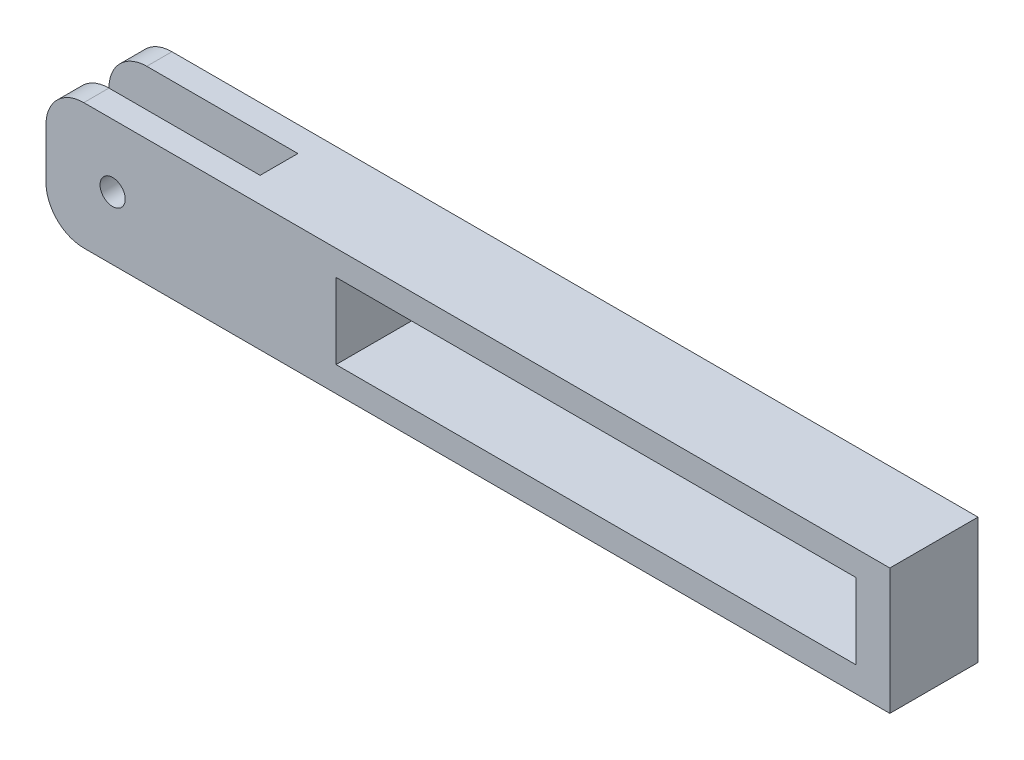
ISO-10303-21;
HEADER;
FILE_DESCRIPTION(('STEP AP214'),'2;1');
FILE_NAME('part.step','',(''),(''),'','','');
FILE_SCHEMA(('AUTOMOTIVE_DESIGN { 1 0 10303 214 1 1 1 1 }'));
ENDSEC;
DATA;
#1=APPLICATION_CONTEXT('core data for automotive mechanical design processes');
#2=APPLICATION_PROTOCOL_DEFINITION('international standard','automotive_design',2000,#1);
#3=PRODUCT_CONTEXT('',#1,'mechanical');
#4=PRODUCT('Part','Part','',(#3));
#5=PRODUCT_RELATED_PRODUCT_CATEGORY('part','',(#4));
#6=PRODUCT_DEFINITION_FORMATION('','',#4);
#7=PRODUCT_DEFINITION_CONTEXT('part definition',#1,'design');
#8=PRODUCT_DEFINITION('design','',#6,#7);
#9=PRODUCT_DEFINITION_SHAPE('','',#8);
#10=(LENGTH_UNIT() NAMED_UNIT(*) SI_UNIT(.MILLI.,.METRE.));
#11=(NAMED_UNIT(*) PLANE_ANGLE_UNIT() SI_UNIT($,.RADIAN.));
#12=(NAMED_UNIT(*) SI_UNIT($,.STERADIAN.) SOLID_ANGLE_UNIT());
#13=UNCERTAINTY_MEASURE_WITH_UNIT(LENGTH_MEASURE(1.E-05),#10,'distance_accuracy_value','');
#14=(GEOMETRIC_REPRESENTATION_CONTEXT(3) GLOBAL_UNCERTAINTY_ASSIGNED_CONTEXT((#13)) GLOBAL_UNIT_ASSIGNED_CONTEXT((#10,
#11,#12)) REPRESENTATION_CONTEXT('',''));
#15=CARTESIAN_POINT('',(0.,0.,0.));
#16=DIRECTION('',(0.,0.,1.));
#17=DIRECTION('',(1.,0.,0.));
#18=AXIS2_PLACEMENT_3D('',#15,#16,#17);
#19=CARTESIAN_POINT('',(-152.5,9.99999999999996,35.));
#20=DIRECTION('',(0.,0.,-1.));
#21=DIRECTION('',(-1.,0.,0.));
#22=AXIS2_PLACEMENT_3D('',#19,#20,#21);
#23=CYLINDRICAL_SURFACE('',#22,15.);
#24=DIRECTION('',(0.,0.,-1.));
#25=VECTOR('',#24,1.);
#26=CARTESIAN_POINT('',(-152.5,24.9999999999999,35.));
#27=LINE('',#26,#25);
#28=CARTESIAN_POINT('',(-152.5,24.9999999999999,35.));
#29=VERTEX_POINT('',#28);
#30=CARTESIAN_POINT('',(-152.5,24.9999999999999,25.));
#31=VERTEX_POINT('',#30);
#32=EDGE_CURVE('E11',#29,#31,#27,.T.);
#33=ORIENTED_EDGE('',*,*,#32,.T.);
#34=CARTESIAN_POINT('',(-152.5,9.99999999999996,25.));
#35=DIRECTION('',(0.,0.,1.));
#36=DIRECTION('',(1.,0.,0.));
#37=AXIS2_PLACEMENT_3D('',#34,#35,#36);
#38=CIRCLE('',#37,15.);
#39=CARTESIAN_POINT('',(-167.5,9.99999999999996,25.));
#40=VERTEX_POINT('',#39);
#41=EDGE_CURVE('E174',#40,#31,#38,.F.);
#42=ORIENTED_EDGE('',*,*,#41,.F.);
#43=DIRECTION('',(0.,0.,-1.));
#44=VECTOR('',#43,1.);
#45=CARTESIAN_POINT('',(-167.5,9.99999999999996,35.));
#46=LINE('',#45,#44);
#47=CARTESIAN_POINT('',(-167.5,9.99999999999996,35.));
#48=VERTEX_POINT('',#47);
#49=EDGE_CURVE('E188',#48,#40,#46,.T.);
#50=ORIENTED_EDGE('',*,*,#49,.F.);
#51=CARTESIAN_POINT('',(-152.5,9.99999999999996,35.));
#52=DIRECTION('',(0.,0.,1.));
#53=DIRECTION('',(1.,0.,0.));
#54=AXIS2_PLACEMENT_3D('',#51,#52,#53);
#55=CIRCLE('',#54,15.);
#56=EDGE_CURVE('E252',#29,#48,#55,.T.);
#57=ORIENTED_EDGE('',*,*,#56,.F.);
#58=EDGE_LOOP('',(#33,#42,#50,#57));
#59=FACE_BOUND('',#58,.T.);
#60=ADVANCED_FACE('F37',(#59),#23,.T.);
#61=CARTESIAN_POINT('',(-167.5,9.99999999999996,35.));
#62=DIRECTION('',(1.,0.,0.));
#63=DIRECTION('',(0.,1.,0.));
#64=AXIS2_PLACEMENT_3D('',#61,#62,#63);
#65=PLANE('',#64);
#66=ORIENTED_EDGE('',*,*,#49,.T.);
#67=DIRECTION('',(0.,-1.,0.));
#68=VECTOR('',#67,1.);
#69=CARTESIAN_POINT('',(-167.5,25.001,25.));
#70=LINE('',#69,#68);
#71=CARTESIAN_POINT('',(-167.5,-10.,25.));
#72=VERTEX_POINT('',#71);
#73=EDGE_CURVE('E258',#40,#72,#70,.T.);
#74=ORIENTED_EDGE('',*,*,#73,.T.);
#75=DIRECTION('',(0.,0.,-1.));
#76=VECTOR('',#75,1.);
#77=CARTESIAN_POINT('',(-167.5,-10.,35.));
#78=LINE('',#77,#76);
#79=CARTESIAN_POINT('',(-167.5,-10.,35.));
#80=VERTEX_POINT('',#79);
#81=EDGE_CURVE('E173',#80,#72,#78,.T.);
#82=ORIENTED_EDGE('',*,*,#81,.F.);
#83=DIRECTION('',(0.,-1.,0.));
#84=VECTOR('',#83,1.);
#85=CARTESIAN_POINT('',(-167.5,9.99999999999996,35.));
#86=LINE('',#85,#84);
#87=EDGE_CURVE('E254',#48,#80,#86,.T.);
#88=ORIENTED_EDGE('',*,*,#87,.F.);
#89=EDGE_LOOP('',(#66,#74,#82,#88));
#90=FACE_BOUND('',#89,.T.);
#91=ADVANCED_FACE('F257',(#90),#65,.F.);
#92=CARTESIAN_POINT('',(-152.5,-10.,35.));
#93=DIRECTION('',(0.,0.,-1.));
#94=DIRECTION('',(-1.,0.,0.));
#95=AXIS2_PLACEMENT_3D('',#92,#93,#94);
#96=CYLINDRICAL_SURFACE('',#95,15.);
#97=ORIENTED_EDGE('',*,*,#81,.T.);
#98=CARTESIAN_POINT('',(-152.5,-10.,25.));
#99=DIRECTION('',(0.,0.,1.));
#100=DIRECTION('',(1.,0.,0.));
#101=AXIS2_PLACEMENT_3D('',#98,#99,#100);
#102=CIRCLE('',#101,15.);
#103=CARTESIAN_POINT('',(-152.5,-25.,25.));
#104=VERTEX_POINT('',#103);
#105=EDGE_CURVE('E155',#104,#72,#102,.F.);
#106=ORIENTED_EDGE('',*,*,#105,.F.);
#107=DIRECTION('',(0.,0.,-1.));
#108=VECTOR('',#107,1.);
#109=CARTESIAN_POINT('',(-152.5,-25.,35.));
#110=LINE('',#109,#108);
#111=CARTESIAN_POINT('',(-152.5,-25.,35.));
#112=VERTEX_POINT('',#111);
#113=EDGE_CURVE('E170',#112,#104,#110,.T.);
#114=ORIENTED_EDGE('',*,*,#113,.F.);
#115=CARTESIAN_POINT('',(-152.5,-10.,35.));
#116=DIRECTION('',(0.,0.,1.));
#117=DIRECTION('',(1.,0.,0.));
#118=AXIS2_PLACEMENT_3D('',#115,#116,#117);
#119=CIRCLE('',#118,15.);
#120=EDGE_CURVE('E238',#80,#112,#119,.T.);
#121=ORIENTED_EDGE('',*,*,#120,.F.);
#122=EDGE_LOOP('',(#97,#106,#114,#121));
#123=FACE_BOUND('',#122,.T.);
#124=ADVANCED_FACE('F168',(#123),#96,.T.);
#125=CARTESIAN_POINT('',(-152.5,9.99999999999996,35.));
#126=DIRECTION('',(0.,0.,1.));
#127=DIRECTION('',(1.,0.,0.));
#128=AXIS2_PLACEMENT_3D('',#125,#126,#127);
#129=PLANE('',#128);
#130=CARTESIAN_POINT('',(-141.050190179339,0.,35.));
#131=DIRECTION('',(0.,0.,-1.));
#132=DIRECTION('',(-1.,0.,0.));
#133=AXIS2_PLACEMENT_3D('',#130,#131,#132);
#134=CIRCLE('',#133,4.99999999999999);
#135=CARTESIAN_POINT('',(-146.050190179339,0.,35.));
#136=VERTEX_POINT('',#135);
#137=EDGE_CURVE('E358',#136,#136,#134,.T.);
#138=ORIENTED_EDGE('',*,*,#137,.T.);
#139=EDGE_LOOP('',(#138));
#140=FACE_BOUND('',#139,.T.);
#141=DIRECTION('',(-1.,0.,0.));
#142=VECTOR('',#141,1.);
#143=CARTESIAN_POINT('',(167.5,25.,35.));
#144=LINE('',#143,#142);
#145=CARTESIAN_POINT('',(167.5,25.,35.));
#146=VERTEX_POINT('',#145);
#147=EDGE_CURVE('E226',#146,#29,#144,.T.);
#148=ORIENTED_EDGE('',*,*,#147,.T.);
#149=ORIENTED_EDGE('',*,*,#56,.T.);
#150=ORIENTED_EDGE('',*,*,#87,.T.);
#151=ORIENTED_EDGE('',*,*,#120,.T.);
#152=DIRECTION('',(1.,0.,0.));
#153=VECTOR('',#152,1.);
#154=CARTESIAN_POINT('',(-152.5,-25.,35.));
#155=LINE('',#154,#153);
#156=CARTESIAN_POINT('',(167.5,-25.,35.));
#157=VERTEX_POINT('',#156);
#158=EDGE_CURVE('E178',#112,#157,#155,.T.);
#159=ORIENTED_EDGE('',*,*,#158,.T.);
#160=DIRECTION('',(0.,1.,0.));
#161=VECTOR('',#160,1.);
#162=CARTESIAN_POINT('',(167.5,-25.,35.));
#163=LINE('',#162,#161);
#164=EDGE_CURVE('E229',#157,#146,#163,.T.);
#165=ORIENTED_EDGE('',*,*,#164,.T.);
#166=EDGE_LOOP('',(#148,#149,#150,#151,#159,#165));
#167=FACE_BOUND('',#166,.T.);
#168=DIRECTION('',(0.,-1.,0.));
#169=VECTOR('',#168,1.);
#170=CARTESIAN_POINT('',(-52.3664437328455,-15.,35.));
#171=LINE('',#170,#169);
#172=CARTESIAN_POINT('',(-52.3664437328455,15.,35.));
#173=VERTEX_POINT('',#172);
#174=CARTESIAN_POINT('',(-52.3664437328455,-15.,35.));
#175=VERTEX_POINT('',#174);
#176=EDGE_CURVE('E274',#173,#175,#171,.T.);
#177=ORIENTED_EDGE('',*,*,#176,.F.);
#178=DIRECTION('',(-1.,0.,0.));
#179=VECTOR('',#178,1.);
#180=CARTESIAN_POINT('',(-52.3664437328455,15.,35.));
#181=LINE('',#180,#179);
#182=CARTESIAN_POINT('',(154.017484838583,15.,35.));
#183=VERTEX_POINT('',#182);
#184=EDGE_CURVE('E272',#183,#173,#181,.T.);
#185=ORIENTED_EDGE('',*,*,#184,.F.);
#186=DIRECTION('',(0.,1.,0.));
#187=VECTOR('',#186,1.);
#188=CARTESIAN_POINT('',(154.017484838583,15.,35.));
#189=LINE('',#188,#187);
#190=CARTESIAN_POINT('',(154.017484838583,-15.,35.));
#191=VERTEX_POINT('',#190);
#192=EDGE_CURVE('E279',#191,#183,#189,.T.);
#193=ORIENTED_EDGE('',*,*,#192,.F.);
#194=DIRECTION('',(1.,0.,0.));
#195=VECTOR('',#194,1.);
#196=CARTESIAN_POINT('',(-52.3664437328455,-15.,35.));
#197=LINE('',#196,#195);
#198=EDGE_CURVE('E277',#175,#191,#197,.T.);
#199=ORIENTED_EDGE('',*,*,#198,.F.);
#200=EDGE_LOOP('',(#177,#185,#193,#199));
#201=FACE_BOUND('',#200,.T.);
#202=ADVANCED_FACE('F255',(#140,#167,#201),#129,.T.);
#203=CARTESIAN_POINT('',(-152.5,9.99999999999996,0.));
#204=DIRECTION('',(0.,0.,1.));
#205=DIRECTION('',(1.,0.,0.));
#206=AXIS2_PLACEMENT_3D('',#203,#204,#205);
#207=PLANE('',#206);
#208=CARTESIAN_POINT('',(-141.050190179339,0.,0.));
#209=DIRECTION('',(0.,0.,-1.));
#210=DIRECTION('',(-1.,0.,0.));
#211=AXIS2_PLACEMENT_3D('',#208,#209,#210);
#212=CIRCLE('',#211,4.99999999999999);
#213=CARTESIAN_POINT('',(-146.050190179339,0.,0.));
#214=VERTEX_POINT('',#213);
#215=EDGE_CURVE('E355',#214,#214,#212,.T.);
#216=ORIENTED_EDGE('',*,*,#215,.F.);
#217=EDGE_LOOP('',(#216));
#218=FACE_BOUND('',#217,.T.);
#219=DIRECTION('',(-1.,0.,0.));
#220=VECTOR('',#219,1.);
#221=CARTESIAN_POINT('',(167.5,25.,0.));
#222=LINE('',#221,#220);
#223=CARTESIAN_POINT('',(167.5,25.,0.));
#224=VERTEX_POINT('',#223);
#225=CARTESIAN_POINT('',(-152.5,24.9999999999999,0.));
#226=VERTEX_POINT('',#225);
#227=EDGE_CURVE('E212',#224,#226,#222,.T.);
#228=ORIENTED_EDGE('',*,*,#227,.F.);
#229=DIRECTION('',(0.,1.,0.));
#230=VECTOR('',#229,1.);
#231=CARTESIAN_POINT('',(167.5,-25.,0.));
#232=LINE('',#231,#230);
#233=CARTESIAN_POINT('',(167.5,-25.,0.));
#234=VERTEX_POINT('',#233);
#235=EDGE_CURVE('E225',#234,#224,#232,.T.);
#236=ORIENTED_EDGE('',*,*,#235,.F.);
#237=DIRECTION('',(1.,0.,0.));
#238=VECTOR('',#237,1.);
#239=CARTESIAN_POINT('',(-152.5,-25.,0.));
#240=LINE('',#239,#238);
#241=CARTESIAN_POINT('',(-152.5,-25.,0.));
#242=VERTEX_POINT('',#241);
#243=EDGE_CURVE('E220',#242,#234,#240,.T.);
#244=ORIENTED_EDGE('',*,*,#243,.F.);
#245=CARTESIAN_POINT('',(-152.5,-10.,0.));
#246=DIRECTION('',(0.,0.,1.));
#247=DIRECTION('',(1.,0.,0.));
#248=AXIS2_PLACEMENT_3D('',#245,#246,#247);
#249=CIRCLE('',#248,15.);
#250=CARTESIAN_POINT('',(-167.5,-10.,0.));
#251=VERTEX_POINT('',#250);
#252=EDGE_CURVE('E218',#251,#242,#249,.T.);
#253=ORIENTED_EDGE('',*,*,#252,.F.);
#254=DIRECTION('',(0.,-1.,0.));
#255=VECTOR('',#254,1.);
#256=CARTESIAN_POINT('',(-167.5,9.99999999999996,0.));
#257=LINE('',#256,#255);
#258=CARTESIAN_POINT('',(-167.5,9.99999999999996,0.));
#259=VERTEX_POINT('',#258);
#260=EDGE_CURVE('E201',#259,#251,#257,.T.);
#261=ORIENTED_EDGE('',*,*,#260,.F.);
#262=CARTESIAN_POINT('',(-152.5,9.99999999999996,0.));
#263=DIRECTION('',(0.,0.,1.));
#264=DIRECTION('',(1.,0.,0.));
#265=AXIS2_PLACEMENT_3D('',#262,#263,#264);
#266=CIRCLE('',#265,15.);
#267=EDGE_CURVE('E206',#226,#259,#266,.T.);
#268=ORIENTED_EDGE('',*,*,#267,.F.);
#269=EDGE_LOOP('',(#228,#236,#244,#253,#261,#268));
#270=FACE_BOUND('',#269,.T.);
#271=DIRECTION('',(-1.,0.,0.));
#272=VECTOR('',#271,1.);
#273=CARTESIAN_POINT('',(-52.3664437328455,15.,0.));
#274=LINE('',#273,#272);
#275=CARTESIAN_POINT('',(154.017484838583,15.,0.));
#276=VERTEX_POINT('',#275);
#277=CARTESIAN_POINT('',(-52.3664437328455,15.,0.));
#278=VERTEX_POINT('',#277);
#279=EDGE_CURVE('E271',#276,#278,#274,.T.);
#280=ORIENTED_EDGE('',*,*,#279,.T.);
#281=DIRECTION('',(0.,-1.,0.));
#282=VECTOR('',#281,1.);
#283=CARTESIAN_POINT('',(-52.3664437328455,-15.,0.));
#284=LINE('',#283,#282);
#285=CARTESIAN_POINT('',(-52.3664437328455,-15.,0.));
#286=VERTEX_POINT('',#285);
#287=EDGE_CURVE('E283',#278,#286,#284,.T.);
#288=ORIENTED_EDGE('',*,*,#287,.T.);
#289=DIRECTION('',(1.,0.,0.));
#290=VECTOR('',#289,1.);
#291=CARTESIAN_POINT('',(-52.3664437328455,-15.,0.));
#292=LINE('',#291,#290);
#293=CARTESIAN_POINT('',(154.017484838583,-15.,0.));
#294=VERTEX_POINT('',#293);
#295=EDGE_CURVE('E286',#286,#294,#292,.T.);
#296=ORIENTED_EDGE('',*,*,#295,.T.);
#297=DIRECTION('',(0.,1.,0.));
#298=VECTOR('',#297,1.);
#299=CARTESIAN_POINT('',(154.017484838583,15.,0.));
#300=LINE('',#299,#298);
#301=EDGE_CURVE('E275',#294,#276,#300,.T.);
#302=ORIENTED_EDGE('',*,*,#301,.T.);
#303=EDGE_LOOP('',(#280,#288,#296,#302));
#304=FACE_BOUND('',#303,.T.);
#305=ADVANCED_FACE('F214',(#218,#270,#304),#207,.F.);
#306=CARTESIAN_POINT('',(167.5,25.,35.));
#307=DIRECTION('',(0.,-1.,0.));
#308=DIRECTION('',(1.,0.,0.));
#309=AXIS2_PLACEMENT_3D('',#306,#307,#308);
#310=PLANE('',#309);
#311=DIRECTION('',(0.,0.,-1.));
#312=VECTOR('',#311,1.);
#313=CARTESIAN_POINT('',(-92.5,25.,25.));
#314=LINE('',#313,#312);
#315=CARTESIAN_POINT('',(-92.5,25.,25.));
#316=VERTEX_POINT('',#315);
#317=CARTESIAN_POINT('',(-92.5,25.,10.));
#318=VERTEX_POINT('',#317);
#319=EDGE_CURVE('E337',#316,#318,#314,.T.);
#320=ORIENTED_EDGE('',*,*,#319,.F.);
#321=DIRECTION('',(1.,0.,0.));
#322=VECTOR('',#321,1.);
#323=CARTESIAN_POINT('',(-167.5,25.,25.));
#324=LINE('',#323,#322);
#325=EDGE_CURVE('E339',#31,#316,#324,.T.);
#326=ORIENTED_EDGE('',*,*,#325,.F.);
#327=ORIENTED_EDGE('',*,*,#32,.F.);
#328=ORIENTED_EDGE('',*,*,#147,.F.);
#329=DIRECTION('',(0.,0.,-1.));
#330=VECTOR('',#329,1.);
#331=CARTESIAN_POINT('',(167.5,25.,35.));
#332=LINE('',#331,#330);
#333=EDGE_CURVE('E227',#146,#224,#332,.T.);
#334=ORIENTED_EDGE('',*,*,#333,.T.);
#335=ORIENTED_EDGE('',*,*,#227,.T.);
#336=CARTESIAN_POINT('',(-152.5,24.9999999999999,9.99999999999999));
#337=VERTEX_POINT('',#336);
#338=EDGE_CURVE('E46',#337,#226,#27,.T.);
#339=ORIENTED_EDGE('',*,*,#338,.F.);
#340=DIRECTION('',(-1.,0.,0.));
#341=VECTOR('',#340,1.);
#342=CARTESIAN_POINT('',(-92.5,25.,10.));
#343=LINE('',#342,#341);
#344=EDGE_CURVE('E262',#318,#337,#343,.T.);
#345=ORIENTED_EDGE('',*,*,#344,.F.);
#346=EDGE_LOOP('',(#320,#326,#327,#328,#334,#335,#339,#345));
#347=FACE_BOUND('',#346,.T.);
#348=ADVANCED_FACE('F39',(#347),#310,.F.);
#349=CARTESIAN_POINT('',(-167.5,9.99999999999996,9.99999999999999));
#350=VERTEX_POINT('',#349);
#351=EDGE_CURVE('E187',#350,#259,#46,.T.);
#352=ORIENTED_EDGE('',*,*,#351,.F.);
#353=CARTESIAN_POINT('',(-152.5,9.99999999999996,9.99999999999999));
#354=DIRECTION('',(0.,0.,-1.));
#355=DIRECTION('',(-1.,0.,0.));
#356=AXIS2_PLACEMENT_3D('',#353,#354,#355);
#357=CIRCLE('',#356,15.);
#358=EDGE_CURVE('E260',#337,#350,#357,.F.);
#359=ORIENTED_EDGE('',*,*,#358,.F.);
#360=ORIENTED_EDGE('',*,*,#338,.T.);
#361=ORIENTED_EDGE('',*,*,#267,.T.);
#362=EDGE_LOOP('',(#352,#359,#360,#361));
#363=FACE_BOUND('',#362,.T.);
#364=ADVANCED_FACE('F207',(#363),#23,.T.);
#365=CARTESIAN_POINT('',(-167.5,-10.,9.99999999999999));
#366=VERTEX_POINT('',#365);
#367=EDGE_CURVE('E179',#366,#251,#78,.T.);
#368=ORIENTED_EDGE('',*,*,#367,.F.);
#369=DIRECTION('',(0.,-1.,0.));
#370=VECTOR('',#369,1.);
#371=CARTESIAN_POINT('',(-167.5,25.001,9.99999999999999));
#372=LINE('',#371,#370);
#373=EDGE_CURVE('E162',#350,#366,#372,.T.);
#374=ORIENTED_EDGE('',*,*,#373,.F.);
#375=ORIENTED_EDGE('',*,*,#351,.T.);
#376=ORIENTED_EDGE('',*,*,#260,.T.);
#377=EDGE_LOOP('',(#368,#374,#375,#376));
#378=FACE_BOUND('',#377,.T.);
#379=ADVANCED_FACE('F199',(#378),#65,.F.);
#380=CARTESIAN_POINT('',(-152.5,-25.,9.99999999999999));
#381=VERTEX_POINT('',#380);
#382=EDGE_CURVE('E180',#381,#242,#110,.T.);
#383=ORIENTED_EDGE('',*,*,#382,.F.);
#384=CARTESIAN_POINT('',(-152.5,-10.,9.99999999999999));
#385=DIRECTION('',(0.,0.,-1.));
#386=DIRECTION('',(-1.,0.,0.));
#387=AXIS2_PLACEMENT_3D('',#384,#385,#386);
#388=CIRCLE('',#387,15.);
#389=EDGE_CURVE('E53',#366,#381,#388,.F.);
#390=ORIENTED_EDGE('',*,*,#389,.F.);
#391=ORIENTED_EDGE('',*,*,#367,.T.);
#392=ORIENTED_EDGE('',*,*,#252,.T.);
#393=EDGE_LOOP('',(#383,#390,#391,#392));
#394=FACE_BOUND('',#393,.T.);
#395=ADVANCED_FACE('F327',(#394),#96,.T.);
#396=CARTESIAN_POINT('',(-152.5,-25.,35.));
#397=DIRECTION('',(0.,1.,0.));
#398=DIRECTION('',(0.,0.,1.));
#399=AXIS2_PLACEMENT_3D('',#396,#397,#398);
#400=PLANE('',#399);
#401=ORIENTED_EDGE('',*,*,#113,.T.);
#402=DIRECTION('',(-1.,0.,0.));
#403=VECTOR('',#402,1.);
#404=CARTESIAN_POINT('',(-167.5,-25.,25.));
#405=LINE('',#404,#403);
#406=CARTESIAN_POINT('',(-92.5,-25.,25.));
#407=VERTEX_POINT('',#406);
#408=EDGE_CURVE('E151',#407,#104,#405,.T.);
#409=ORIENTED_EDGE('',*,*,#408,.F.);
#410=DIRECTION('',(0.,0.,1.));
#411=VECTOR('',#410,1.);
#412=CARTESIAN_POINT('',(-92.5,-25.,25.));
#413=LINE('',#412,#411);
#414=CARTESIAN_POINT('',(-92.5,-25.,10.));
#415=VERTEX_POINT('',#414);
#416=EDGE_CURVE('E163',#415,#407,#413,.T.);
#417=ORIENTED_EDGE('',*,*,#416,.F.);
#418=DIRECTION('',(1.,0.,0.));
#419=VECTOR('',#418,1.);
#420=CARTESIAN_POINT('',(-92.5,-25.,10.));
#421=LINE('',#420,#419);
#422=EDGE_CURVE('E342',#381,#415,#421,.T.);
#423=ORIENTED_EDGE('',*,*,#422,.F.);
#424=ORIENTED_EDGE('',*,*,#382,.T.);
#425=ORIENTED_EDGE('',*,*,#243,.T.);
#426=DIRECTION('',(0.,0.,-1.));
#427=VECTOR('',#426,1.);
#428=CARTESIAN_POINT('',(167.5,-25.,35.));
#429=LINE('',#428,#427);
#430=EDGE_CURVE('E183',#157,#234,#429,.T.);
#431=ORIENTED_EDGE('',*,*,#430,.F.);
#432=ORIENTED_EDGE('',*,*,#158,.F.);
#433=EDGE_LOOP('',(#401,#409,#417,#423,#424,#425,#431,#432));
#434=FACE_BOUND('',#433,.T.);
#435=ADVANCED_FACE('F176',(#434),#400,.F.);
#436=CARTESIAN_POINT('',(167.5,-25.,35.));
#437=DIRECTION('',(-1.,0.,0.));
#438=DIRECTION('',(0.,-1.,0.));
#439=AXIS2_PLACEMENT_3D('',#436,#437,#438);
#440=PLANE('',#439);
#441=ORIENTED_EDGE('',*,*,#235,.T.);
#442=ORIENTED_EDGE('',*,*,#333,.F.);
#443=ORIENTED_EDGE('',*,*,#164,.F.);
#444=ORIENTED_EDGE('',*,*,#430,.T.);
#445=EDGE_LOOP('',(#441,#442,#443,#444));
#446=FACE_BOUND('',#445,.T.);
#447=ADVANCED_FACE('F306',(#446),#440,.F.);
#448=CARTESIAN_POINT('',(-52.3664437328455,15.,35.));
#449=DIRECTION('',(0.,-1.,0.));
#450=DIRECTION('',(0.,0.,-1.));
#451=AXIS2_PLACEMENT_3D('',#448,#449,#450);
#452=PLANE('',#451);
#453=ORIENTED_EDGE('',*,*,#279,.F.);
#454=DIRECTION('',(0.,0.,-1.));
#455=VECTOR('',#454,1.);
#456=CARTESIAN_POINT('',(154.017484838583,15.,35.));
#457=LINE('',#456,#455);
#458=EDGE_CURVE('E281',#183,#276,#457,.T.);
#459=ORIENTED_EDGE('',*,*,#458,.F.);
#460=ORIENTED_EDGE('',*,*,#184,.T.);
#461=DIRECTION('',(0.,0.,-1.));
#462=VECTOR('',#461,1.);
#463=CARTESIAN_POINT('',(-52.3664437328455,15.,35.));
#464=LINE('',#463,#462);
#465=EDGE_CURVE('E241',#173,#278,#464,.T.);
#466=ORIENTED_EDGE('',*,*,#465,.T.);
#467=EDGE_LOOP('',(#453,#459,#460,#466));
#468=FACE_BOUND('',#467,.T.);
#469=ADVANCED_FACE('F304',(#468),#452,.T.);
#470=CARTESIAN_POINT('',(-52.3664437328455,-15.,35.));
#471=DIRECTION('',(1.,0.,0.));
#472=DIRECTION('',(0.,0.,-1.));
#473=AXIS2_PLACEMENT_3D('',#470,#471,#472);
#474=PLANE('',#473);
#475=ORIENTED_EDGE('',*,*,#287,.F.);
#476=ORIENTED_EDGE('',*,*,#465,.F.);
#477=ORIENTED_EDGE('',*,*,#176,.T.);
#478=DIRECTION('',(0.,0.,-1.));
#479=VECTOR('',#478,1.);
#480=CARTESIAN_POINT('',(-52.3664437328455,-15.,35.));
#481=LINE('',#480,#479);
#482=EDGE_CURVE('E243',#175,#286,#481,.T.);
#483=ORIENTED_EDGE('',*,*,#482,.T.);
#484=EDGE_LOOP('',(#475,#476,#477,#483));
#485=FACE_BOUND('',#484,.T.);
#486=ADVANCED_FACE('F301',(#485),#474,.T.);
#487=CARTESIAN_POINT('',(-52.3664437328455,-15.,35.));
#488=DIRECTION('',(0.,1.,0.));
#489=DIRECTION('',(0.,0.,1.));
#490=AXIS2_PLACEMENT_3D('',#487,#488,#489);
#491=PLANE('',#490);
#492=ORIENTED_EDGE('',*,*,#295,.F.);
#493=ORIENTED_EDGE('',*,*,#482,.F.);
#494=ORIENTED_EDGE('',*,*,#198,.T.);
#495=DIRECTION('',(0.,0.,-1.));
#496=VECTOR('',#495,1.);
#497=CARTESIAN_POINT('',(154.017484838583,-15.,35.));
#498=LINE('',#497,#496);
#499=EDGE_CURVE('E61',#191,#294,#498,.T.);
#500=ORIENTED_EDGE('',*,*,#499,.T.);
#501=EDGE_LOOP('',(#492,#493,#494,#500));
#502=FACE_BOUND('',#501,.T.);
#503=ADVANCED_FACE('F294',(#502),#491,.T.);
#504=CARTESIAN_POINT('',(154.017484838583,15.,35.));
#505=DIRECTION('',(-1.,0.,0.));
#506=DIRECTION('',(0.,0.,1.));
#507=AXIS2_PLACEMENT_3D('',#504,#505,#506);
#508=PLANE('',#507);
#509=ORIENTED_EDGE('',*,*,#301,.F.);
#510=ORIENTED_EDGE('',*,*,#499,.F.);
#511=ORIENTED_EDGE('',*,*,#192,.T.);
#512=ORIENTED_EDGE('',*,*,#458,.T.);
#513=EDGE_LOOP('',(#509,#510,#511,#512));
#514=FACE_BOUND('',#513,.T.);
#515=ADVANCED_FACE('F298',(#514),#508,.T.);
#516=CARTESIAN_POINT('',(-167.5,25.001,25.));
#517=DIRECTION('',(0.,0.,1.));
#518=DIRECTION('',(1.,0.,0.));
#519=AXIS2_PLACEMENT_3D('',#516,#517,#518);
#520=PLANE('',#519);
#521=CARTESIAN_POINT('',(-141.050190179339,0.,25.));
#522=DIRECTION('',(0.,0.,1.));
#523=DIRECTION('',(1.,0.,0.));
#524=AXIS2_PLACEMENT_3D('',#521,#522,#523);
#525=CIRCLE('',#524,4.99999999999999);
#526=CARTESIAN_POINT('',(-136.050190179339,0.,25.));
#527=VERTEX_POINT('',#526);
#528=EDGE_CURVE('E350',#527,#527,#525,.T.);
#529=ORIENTED_EDGE('',*,*,#528,.T.);
#530=EDGE_LOOP('',(#529));
#531=FACE_BOUND('',#530,.T.);
#532=ORIENTED_EDGE('',*,*,#325,.T.);
#533=DIRECTION('',(0.,-1.,0.));
#534=VECTOR('',#533,1.);
#535=CARTESIAN_POINT('',(-92.5,25.001,25.));
#536=LINE('',#535,#534);
#537=EDGE_CURVE('E157',#316,#407,#536,.T.);
#538=ORIENTED_EDGE('',*,*,#537,.T.);
#539=ORIENTED_EDGE('',*,*,#408,.T.);
#540=ORIENTED_EDGE('',*,*,#105,.T.);
#541=ORIENTED_EDGE('',*,*,#73,.F.);
#542=ORIENTED_EDGE('',*,*,#41,.T.);
#543=EDGE_LOOP('',(#532,#538,#539,#540,#541,#542));
#544=FACE_BOUND('',#543,.T.);
#545=ADVANCED_FACE('F154',(#531,#544),#520,.F.);
#546=CARTESIAN_POINT('',(-92.5,25.001,25.));
#547=DIRECTION('',(1.,0.,0.));
#548=DIRECTION('',(0.,0.,-1.));
#549=AXIS2_PLACEMENT_3D('',#546,#547,#548);
#550=PLANE('',#549);
#551=ORIENTED_EDGE('',*,*,#319,.T.);
#552=DIRECTION('',(0.,-1.,0.));
#553=VECTOR('',#552,1.);
#554=CARTESIAN_POINT('',(-92.5,25.001,10.));
#555=LINE('',#554,#553);
#556=EDGE_CURVE('E264',#318,#415,#555,.T.);
#557=ORIENTED_EDGE('',*,*,#556,.T.);
#558=ORIENTED_EDGE('',*,*,#416,.T.);
#559=ORIENTED_EDGE('',*,*,#537,.F.);
#560=EDGE_LOOP('',(#551,#557,#558,#559));
#561=FACE_BOUND('',#560,.T.);
#562=ADVANCED_FACE('F346',(#561),#550,.F.);
#563=CARTESIAN_POINT('',(-92.5,25.001,10.));
#564=DIRECTION('',(0.,0.,-1.));
#565=DIRECTION('',(-1.,0.,0.));
#566=AXIS2_PLACEMENT_3D('',#563,#564,#565);
#567=PLANE('',#566);
#568=CARTESIAN_POINT('',(-141.050190179339,0.,9.99999999999999));
#569=DIRECTION('',(0.,0.,-1.));
#570=DIRECTION('',(-1.,0.,0.));
#571=AXIS2_PLACEMENT_3D('',#568,#569,#570);
#572=CIRCLE('',#571,4.99999999999999);
#573=CARTESIAN_POINT('',(-146.050190179339,0.,9.99999999999999));
#574=VERTEX_POINT('',#573);
#575=EDGE_CURVE('E41',#574,#574,#572,.T.);
#576=ORIENTED_EDGE('',*,*,#575,.T.);
#577=EDGE_LOOP('',(#576));
#578=FACE_BOUND('',#577,.T.);
#579=ORIENTED_EDGE('',*,*,#344,.T.);
#580=ORIENTED_EDGE('',*,*,#358,.T.);
#581=ORIENTED_EDGE('',*,*,#373,.T.);
#582=ORIENTED_EDGE('',*,*,#389,.T.);
#583=ORIENTED_EDGE('',*,*,#422,.T.);
#584=ORIENTED_EDGE('',*,*,#556,.F.);
#585=EDGE_LOOP('',(#579,#580,#581,#582,#583,#584));
#586=FACE_BOUND('',#585,.T.);
#587=ADVANCED_FACE('F365',(#578,#586),#567,.F.);
#588=CARTESIAN_POINT('',(-141.050190179339,0.,35.));
#589=DIRECTION('',(0.,0.,-1.));
#590=DIRECTION('',(-1.,0.,0.));
#591=AXIS2_PLACEMENT_3D('',#588,#589,#590);
#592=CYLINDRICAL_SURFACE('',#591,4.99999999999999);
#593=ORIENTED_EDGE('',*,*,#215,.T.);
#594=EDGE_LOOP('',(#593));
#595=FACE_BOUND('',#594,.T.);
#596=ORIENTED_EDGE('',*,*,#575,.F.);
#597=EDGE_LOOP('',(#596));
#598=FACE_BOUND('',#597,.T.);
#599=ADVANCED_FACE('F367',(#595,#598),#592,.F.);
#600=ORIENTED_EDGE('',*,*,#137,.F.);
#601=EDGE_LOOP('',(#600));
#602=FACE_BOUND('',#601,.T.);
#603=ORIENTED_EDGE('',*,*,#528,.F.);
#604=EDGE_LOOP('',(#603));
#605=FACE_BOUND('',#604,.T.);
#606=ADVANCED_FACE('F369',(#602,#605),#592,.F.);
#607=CLOSED_SHELL('',(#60,#91,#124,#202,#305,#348,#364,#379,#395,#435,#447,#469,#486,#503,#515,
#545,#562,#587,#599,#606));
#608=MANIFOLD_SOLID_BREP('B2',#607);
#609=ADVANCED_BREP_SHAPE_REPRESENTATION('',(#18,#608),#14);
#610=SHAPE_DEFINITION_REPRESENTATION(#9,#609);
ENDSEC;
END-ISO-10303-21;
